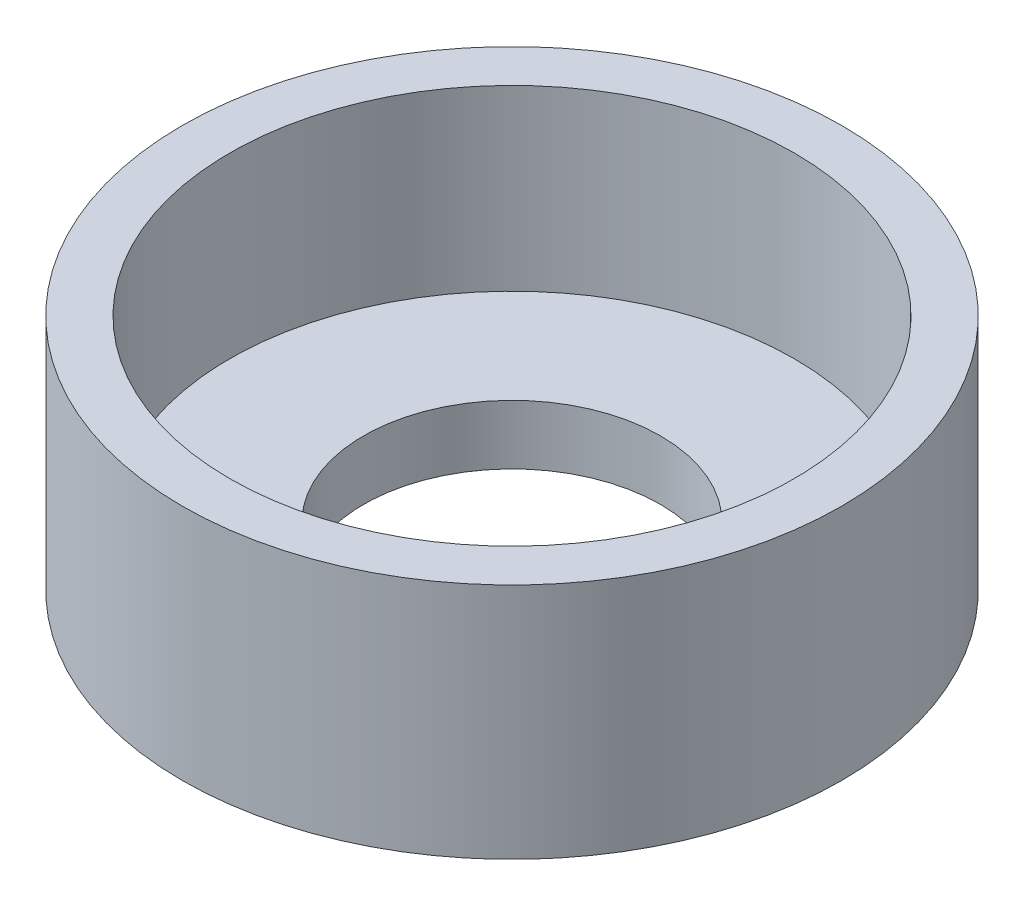
ISO-10303-21;
HEADER;
FILE_DESCRIPTION(('STEP AP214'),'2;1');
FILE_NAME('part.step','',(''),(''),'','','');
FILE_SCHEMA(('AUTOMOTIVE_DESIGN { 1 0 10303 214 1 1 1 1 }'));
ENDSEC;
DATA;
#1=APPLICATION_CONTEXT('core data for automotive mechanical design processes');
#2=APPLICATION_PROTOCOL_DEFINITION('international standard','automotive_design',2000,#1);
#3=PRODUCT_CONTEXT('',#1,'mechanical');
#4=PRODUCT('Part','Part','',(#3));
#5=PRODUCT_RELATED_PRODUCT_CATEGORY('part','',(#4));
#6=PRODUCT_DEFINITION_FORMATION('','',#4);
#7=PRODUCT_DEFINITION_CONTEXT('part definition',#1,'design');
#8=PRODUCT_DEFINITION('design','',#6,#7);
#9=PRODUCT_DEFINITION_SHAPE('','',#8);
#10=(LENGTH_UNIT() NAMED_UNIT(*) SI_UNIT(.MILLI.,.METRE.));
#11=(NAMED_UNIT(*) PLANE_ANGLE_UNIT() SI_UNIT($,.RADIAN.));
#12=(NAMED_UNIT(*) SI_UNIT($,.STERADIAN.) SOLID_ANGLE_UNIT());
#13=UNCERTAINTY_MEASURE_WITH_UNIT(LENGTH_MEASURE(1.E-05),#10,'distance_accuracy_value','');
#14=(GEOMETRIC_REPRESENTATION_CONTEXT(3) GLOBAL_UNCERTAINTY_ASSIGNED_CONTEXT((#13)) GLOBAL_UNIT_ASSIGNED_CONTEXT((#10,
#11,#12)) REPRESENTATION_CONTEXT('',''));
#15=CARTESIAN_POINT('',(0.,0.,0.));
#16=DIRECTION('',(0.,0.,1.));
#17=DIRECTION('',(1.,0.,0.));
#18=AXIS2_PLACEMENT_3D('',#15,#16,#17);
#19=CARTESIAN_POINT('',(0.,2.,0.));
#20=DIRECTION('',(0.,1.,0.));
#21=DIRECTION('',(0.,0.,1.));
#22=AXIS2_PLACEMENT_3D('',#19,#20,#21);
#23=PLANE('',#22);
#24=CARTESIAN_POINT('',(0.,2.,0.));
#25=DIRECTION('',(0.,1.,0.));
#26=DIRECTION('',(0.,0.,1.));
#27=AXIS2_PLACEMENT_3D('',#24,#25,#26);
#28=CIRCLE('',#27,5.);
#29=CARTESIAN_POINT('',(0.,2.,5.));
#30=VERTEX_POINT('',#29);
#31=EDGE_CURVE('E42',#30,#30,#28,.T.);
#32=ORIENTED_EDGE('',*,*,#31,.F.);
#33=EDGE_LOOP('',(#32));
#34=FACE_BOUND('',#33,.T.);
#35=CARTESIAN_POINT('',(0.,2.,0.));
#36=DIRECTION('',(0.,1.,0.));
#37=DIRECTION('',(0.,0.,1.));
#38=AXIS2_PLACEMENT_3D('',#35,#36,#37);
#39=CIRCLE('',#38,9.5);
#40=CARTESIAN_POINT('',(0.,2.,9.5));
#41=VERTEX_POINT('',#40);
#42=EDGE_CURVE('E10',#41,#41,#39,.F.);
#43=ORIENTED_EDGE('',*,*,#42,.F.);
#44=EDGE_LOOP('',(#43));
#45=FACE_BOUND('',#44,.T.);
#46=ADVANCED_FACE('F31',(#34,#45),#23,.T.);
#47=CARTESIAN_POINT('',(0.,0.,0.));
#48=DIRECTION('',(0.,1.,0.));
#49=DIRECTION('',(0.,0.,1.));
#50=AXIS2_PLACEMENT_3D('',#47,#48,#49);
#51=PLANE('',#50);
#52=CARTESIAN_POINT('',(0.,0.,0.));
#53=DIRECTION('',(0.,1.,0.));
#54=DIRECTION('',(0.,0.,1.));
#55=AXIS2_PLACEMENT_3D('',#52,#53,#54);
#56=CIRCLE('',#55,11.1);
#57=CARTESIAN_POINT('',(0.,0.,11.1));
#58=VERTEX_POINT('',#57);
#59=EDGE_CURVE('E38',#58,#58,#56,.T.);
#60=ORIENTED_EDGE('',*,*,#59,.F.);
#61=EDGE_LOOP('',(#60));
#62=FACE_BOUND('',#61,.T.);
#63=CARTESIAN_POINT('',(0.,0.,0.));
#64=DIRECTION('',(0.,1.,0.));
#65=DIRECTION('',(0.,0.,1.));
#66=AXIS2_PLACEMENT_3D('',#63,#64,#65);
#67=CIRCLE('',#66,5.);
#68=CARTESIAN_POINT('',(0.,0.,5.));
#69=VERTEX_POINT('',#68);
#70=EDGE_CURVE('E46',#69,#69,#67,.T.);
#71=ORIENTED_EDGE('',*,*,#70,.T.);
#72=EDGE_LOOP('',(#71));
#73=FACE_BOUND('',#72,.T.);
#74=ADVANCED_FACE('F73',(#62,#73),#51,.F.);
#75=CARTESIAN_POINT('',(0.,2.,0.));
#76=DIRECTION('',(0.,-1.,0.));
#77=DIRECTION('',(0.,0.,-1.));
#78=AXIS2_PLACEMENT_3D('',#75,#76,#77);
#79=CYLINDRICAL_SURFACE('',#78,11.1);
#80=ORIENTED_EDGE('',*,*,#59,.T.);
#81=EDGE_LOOP('',(#80));
#82=FACE_BOUND('',#81,.T.);
#83=CARTESIAN_POINT('',(0.,8.,0.));
#84=DIRECTION('',(0.,1.,0.));
#85=DIRECTION('',(0.,0.,1.));
#86=AXIS2_PLACEMENT_3D('',#83,#84,#85);
#87=CIRCLE('',#86,11.1);
#88=CARTESIAN_POINT('',(0.,8.,11.1));
#89=VERTEX_POINT('',#88);
#90=EDGE_CURVE('E50',#89,#89,#87,.T.);
#91=ORIENTED_EDGE('',*,*,#90,.F.);
#92=EDGE_LOOP('',(#91));
#93=FACE_BOUND('',#92,.T.);
#94=ADVANCED_FACE('F33',(#82,#93),#79,.T.);
#95=CARTESIAN_POINT('',(0.,2.,0.));
#96=DIRECTION('',(0.,-1.,0.));
#97=DIRECTION('',(0.,0.,-1.));
#98=AXIS2_PLACEMENT_3D('',#95,#96,#97);
#99=CYLINDRICAL_SURFACE('',#98,5.);
#100=ORIENTED_EDGE('',*,*,#31,.T.);
#101=EDGE_LOOP('',(#100));
#102=FACE_BOUND('',#101,.T.);
#103=ORIENTED_EDGE('',*,*,#70,.F.);
#104=EDGE_LOOP('',(#103));
#105=FACE_BOUND('',#104,.T.);
#106=ADVANCED_FACE('F62',(#102,#105),#99,.F.);
#107=CARTESIAN_POINT('',(0.,8.,0.));
#108=DIRECTION('',(0.,1.,0.));
#109=DIRECTION('',(0.,0.,1.));
#110=AXIS2_PLACEMENT_3D('',#107,#108,#109);
#111=PLANE('',#110);
#112=ORIENTED_EDGE('',*,*,#90,.T.);
#113=EDGE_LOOP('',(#112));
#114=FACE_BOUND('',#113,.T.);
#115=CARTESIAN_POINT('',(0.,8.,0.));
#116=DIRECTION('',(0.,1.,0.));
#117=DIRECTION('',(0.,0.,1.));
#118=AXIS2_PLACEMENT_3D('',#115,#116,#117);
#119=CIRCLE('',#118,9.5);
#120=CARTESIAN_POINT('',(0.,8.,9.5));
#121=VERTEX_POINT('',#120);
#122=EDGE_CURVE('E54',#121,#121,#119,.T.);
#123=ORIENTED_EDGE('',*,*,#122,.F.);
#124=EDGE_LOOP('',(#123));
#125=FACE_BOUND('',#124,.T.);
#126=ADVANCED_FACE('F60',(#114,#125),#111,.T.);
#127=CARTESIAN_POINT('',(0.,8.,0.));
#128=DIRECTION('',(0.,-1.,0.));
#129=DIRECTION('',(0.,0.,-1.));
#130=AXIS2_PLACEMENT_3D('',#127,#128,#129);
#131=CYLINDRICAL_SURFACE('',#130,9.5);
#132=ORIENTED_EDGE('',*,*,#122,.T.);
#133=EDGE_LOOP('',(#132));
#134=FACE_BOUND('',#133,.T.);
#135=ORIENTED_EDGE('',*,*,#42,.T.);
#136=EDGE_LOOP('',(#135));
#137=FACE_BOUND('',#136,.T.);
#138=ADVANCED_FACE('F58',(#134,#137),#131,.F.);
#139=CLOSED_SHELL('',(#46,#74,#94,#106,#126,#138));
#140=MANIFOLD_SOLID_BREP('B2',#139);
#141=ADVANCED_BREP_SHAPE_REPRESENTATION('',(#18,#140),#14);
#142=SHAPE_DEFINITION_REPRESENTATION(#9,#141);
ENDSEC;
END-ISO-10303-21;
